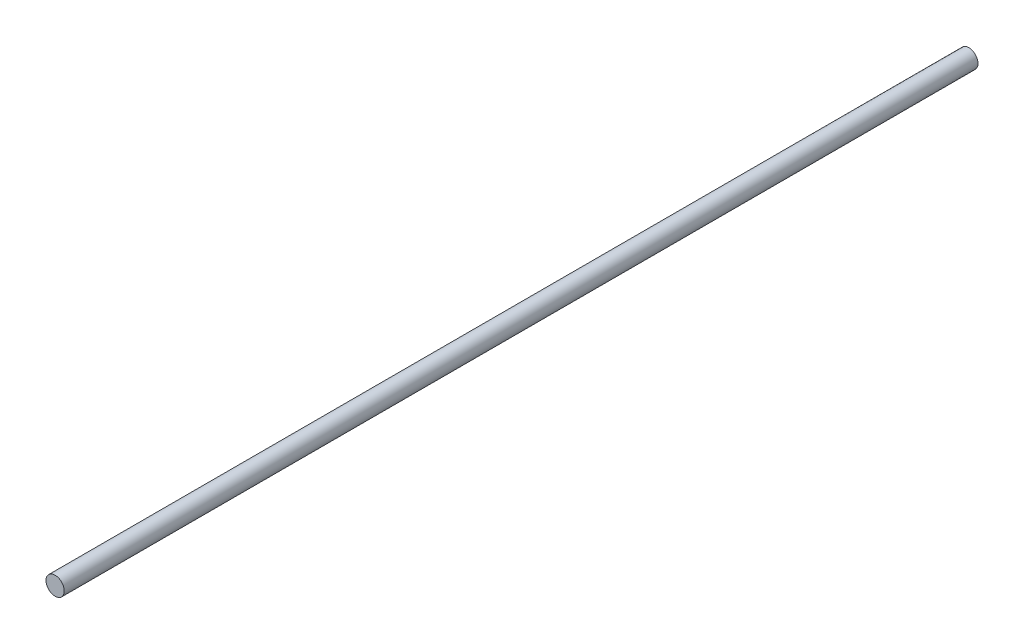
ISO-10303-21;
HEADER;
FILE_DESCRIPTION(('STEP AP214'),'2;1');
FILE_NAME('part.step','',(''),(''),'','','');
FILE_SCHEMA(('AUTOMOTIVE_DESIGN { 1 0 10303 214 1 1 1 1 }'));
ENDSEC;
DATA;
#1=APPLICATION_CONTEXT('core data for automotive mechanical design processes');
#2=APPLICATION_PROTOCOL_DEFINITION('international standard','automotive_design',2000,#1);
#3=PRODUCT_CONTEXT('',#1,'mechanical');
#4=PRODUCT('Part','Part','',(#3));
#5=PRODUCT_RELATED_PRODUCT_CATEGORY('part','',(#4));
#6=PRODUCT_DEFINITION_FORMATION('','',#4);
#7=PRODUCT_DEFINITION_CONTEXT('part definition',#1,'design');
#8=PRODUCT_DEFINITION('design','',#6,#7);
#9=PRODUCT_DEFINITION_SHAPE('','',#8);
#10=(LENGTH_UNIT() NAMED_UNIT(*) SI_UNIT(.MILLI.,.METRE.));
#11=(NAMED_UNIT(*) PLANE_ANGLE_UNIT() SI_UNIT($,.RADIAN.));
#12=(NAMED_UNIT(*) SI_UNIT($,.STERADIAN.) SOLID_ANGLE_UNIT());
#13=UNCERTAINTY_MEASURE_WITH_UNIT(LENGTH_MEASURE(1.E-05),#10,'distance_accuracy_value','');
#14=(GEOMETRIC_REPRESENTATION_CONTEXT(3) GLOBAL_UNCERTAINTY_ASSIGNED_CONTEXT((#13)) GLOBAL_UNIT_ASSIGNED_CONTEXT((#10,
#11,#12)) REPRESENTATION_CONTEXT('',''));
#15=CARTESIAN_POINT('',(0.,0.,0.));
#16=DIRECTION('',(0.,0.,1.));
#17=DIRECTION('',(1.,0.,0.));
#18=AXIS2_PLACEMENT_3D('',#15,#16,#17);
#19=CARTESIAN_POINT('',(0.,0.,50.));
#20=DIRECTION('',(0.,0.,-1.));
#21=DIRECTION('',(-1.,0.,0.));
#22=AXIS2_PLACEMENT_3D('',#19,#20,#21);
#23=CYLINDRICAL_SURFACE('',#22,1.);
#24=CARTESIAN_POINT('',(0.,0.,50.));
#25=DIRECTION('',(0.,0.,1.));
#26=DIRECTION('',(1.,0.,0.));
#27=AXIS2_PLACEMENT_3D('',#24,#25,#26);
#28=CIRCLE('',#27,1.);
#29=CARTESIAN_POINT('',(1.,0.,50.));
#30=VERTEX_POINT('',#29);
#31=EDGE_CURVE('E10',#30,#30,#28,.T.);
#32=ORIENTED_EDGE('',*,*,#31,.F.);
#33=EDGE_LOOP('',(#32));
#34=FACE_BOUND('',#33,.T.);
#35=CARTESIAN_POINT('',(0.,0.,-50.));
#36=DIRECTION('',(0.,0.,1.));
#37=DIRECTION('',(1.,0.,0.));
#38=AXIS2_PLACEMENT_3D('',#35,#36,#37);
#39=CIRCLE('',#38,1.);
#40=CARTESIAN_POINT('',(1.,0.,-50.));
#41=VERTEX_POINT('',#40);
#42=EDGE_CURVE('E37',#41,#41,#39,.T.);
#43=ORIENTED_EDGE('',*,*,#42,.T.);
#44=EDGE_LOOP('',(#43));
#45=FACE_BOUND('',#44,.T.);
#46=ADVANCED_FACE('F34',(#34,#45),#23,.T.);
#47=CARTESIAN_POINT('',(0.,0.,50.));
#48=DIRECTION('',(0.,0.,1.));
#49=DIRECTION('',(1.,0.,0.));
#50=AXIS2_PLACEMENT_3D('',#47,#48,#49);
#51=PLANE('',#50);
#52=ORIENTED_EDGE('',*,*,#31,.T.);
#53=EDGE_LOOP('',(#52));
#54=FACE_BOUND('',#53,.T.);
#55=ADVANCED_FACE('F49',(#54),#51,.T.);
#56=CARTESIAN_POINT('',(0.,0.,-50.));
#57=DIRECTION('',(0.,0.,1.));
#58=DIRECTION('',(1.,0.,0.));
#59=AXIS2_PLACEMENT_3D('',#56,#57,#58);
#60=PLANE('',#59);
#61=ORIENTED_EDGE('',*,*,#42,.F.);
#62=EDGE_LOOP('',(#61));
#63=FACE_BOUND('',#62,.T.);
#64=ADVANCED_FACE('F47',(#63),#60,.F.);
#65=CLOSED_SHELL('',(#46,#55,#64));
#66=MANIFOLD_SOLID_BREP('B2',#65);
#67=ADVANCED_BREP_SHAPE_REPRESENTATION('',(#18,#66),#14);
#68=SHAPE_DEFINITION_REPRESENTATION(#9,#67);
ENDSEC;
END-ISO-10303-21;
